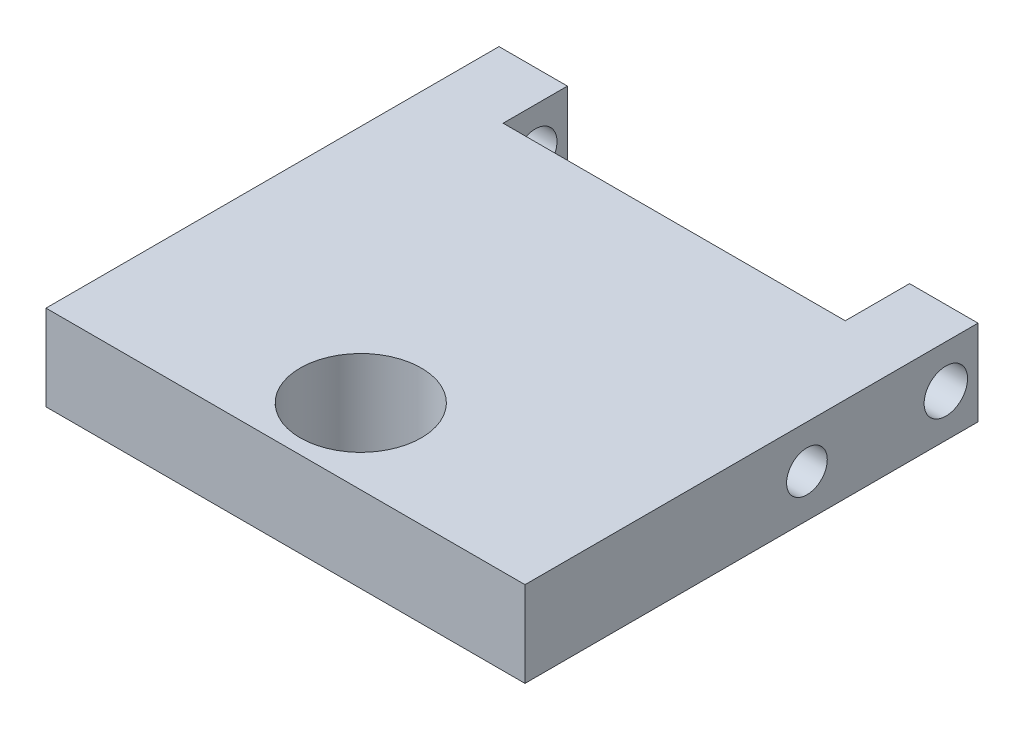
ISO-10303-21;
HEADER;
FILE_DESCRIPTION(('STEP AP214'),'2;1');
FILE_NAME('part.step','',(''),(''),'','','');
FILE_SCHEMA(('AUTOMOTIVE_DESIGN { 1 0 10303 214 1 1 1 1 }'));
ENDSEC;
DATA;
#1=APPLICATION_CONTEXT('core data for automotive mechanical design processes');
#2=APPLICATION_PROTOCOL_DEFINITION('international standard','automotive_design',2000,#1);
#3=PRODUCT_CONTEXT('',#1,'mechanical');
#4=PRODUCT('Part','Part','',(#3));
#5=PRODUCT_RELATED_PRODUCT_CATEGORY('part','',(#4));
#6=PRODUCT_DEFINITION_FORMATION('','',#4);
#7=PRODUCT_DEFINITION_CONTEXT('part definition',#1,'design');
#8=PRODUCT_DEFINITION('design','',#6,#7);
#9=PRODUCT_DEFINITION_SHAPE('','',#8);
#10=(LENGTH_UNIT() NAMED_UNIT(*) SI_UNIT(.MILLI.,.METRE.));
#11=(NAMED_UNIT(*) PLANE_ANGLE_UNIT() SI_UNIT($,.RADIAN.));
#12=(NAMED_UNIT(*) SI_UNIT($,.STERADIAN.) SOLID_ANGLE_UNIT());
#13=UNCERTAINTY_MEASURE_WITH_UNIT(LENGTH_MEASURE(1.E-05),#10,'distance_accuracy_value','');
#14=(GEOMETRIC_REPRESENTATION_CONTEXT(3) GLOBAL_UNCERTAINTY_ASSIGNED_CONTEXT((#13)) GLOBAL_UNIT_ASSIGNED_CONTEXT((#10,
#11,#12)) REPRESENTATION_CONTEXT('',''));
#15=CARTESIAN_POINT('',(0.,0.,0.));
#16=DIRECTION('',(0.,0.,1.));
#17=DIRECTION('',(1.,0.,0.));
#18=AXIS2_PLACEMENT_3D('',#15,#16,#17);
#19=CARTESIAN_POINT('',(-8.89,3.175,-8.4074));
#20=DIRECTION('',(0.,0.,1.));
#21=DIRECTION('',(1.,0.,0.));
#22=AXIS2_PLACEMENT_3D('',#19,#20,#21);
#23=PLANE('',#22);
#24=DIRECTION('',(0.,-1.,0.));
#25=VECTOR('',#24,1.);
#26=CARTESIAN_POINT('',(6.35,3.175,-8.4074));
#27=LINE('',#26,#25);
#28=CARTESIAN_POINT('',(6.35,3.175,-8.4074));
#29=VERTEX_POINT('',#28);
#30=CARTESIAN_POINT('',(6.35,0.,-8.4074));
#31=VERTEX_POINT('',#30);
#32=EDGE_CURVE('E156',#29,#31,#27,.T.);
#33=ORIENTED_EDGE('',*,*,#32,.F.);
#34=DIRECTION('',(-1.,0.,0.));
#35=VECTOR('',#34,1.);
#36=CARTESIAN_POINT('',(-8.89,3.175,-8.4074));
#37=LINE('',#36,#35);
#38=CARTESIAN_POINT('',(8.89,3.175,-8.4074));
#39=VERTEX_POINT('',#38);
#40=EDGE_CURVE('E89',#39,#29,#37,.T.);
#41=ORIENTED_EDGE('',*,*,#40,.F.);
#42=DIRECTION('',(0.,-1.,0.));
#43=VECTOR('',#42,1.);
#44=CARTESIAN_POINT('',(8.89,3.175,-8.4074));
#45=LINE('',#44,#43);
#46=CARTESIAN_POINT('',(8.89,0.,-8.4074));
#47=VERTEX_POINT('',#46);
#48=EDGE_CURVE('E152',#39,#47,#45,.T.);
#49=ORIENTED_EDGE('',*,*,#48,.T.);
#50=DIRECTION('',(-1.,0.,0.));
#51=VECTOR('',#50,1.);
#52=CARTESIAN_POINT('',(-8.89,0.,-8.4074));
#53=LINE('',#52,#51);
#54=EDGE_CURVE('E134',#47,#31,#53,.T.);
#55=ORIENTED_EDGE('',*,*,#54,.T.);
#56=EDGE_LOOP('',(#33,#41,#49,#55));
#57=FACE_BOUND('',#56,.T.);
#58=ADVANCED_FACE('F35',(#57),#23,.F.);
#59=CARTESIAN_POINT('',(8.89,3.175,8.4074));
#60=DIRECTION('',(-1.,0.,0.));
#61=DIRECTION('',(0.,0.,1.));
#62=AXIS2_PLACEMENT_3D('',#59,#60,#61);
#63=PLANE('',#62);
#64=CARTESIAN_POINT('',(8.89,1.5875,-2.0574));
#65=DIRECTION('',(1.,0.,0.));
#66=DIRECTION('',(0.,0.,-1.));
#67=AXIS2_PLACEMENT_3D('',#64,#65,#66);
#68=CIRCLE('',#67,0.755649999999988);
#69=CARTESIAN_POINT('',(8.89,1.5875,-2.81304999999999));
#70=VERTEX_POINT('',#69);
#71=EDGE_CURVE('E194',#70,#70,#68,.T.);
#72=ORIENTED_EDGE('',*,*,#71,.F.);
#73=EDGE_LOOP('',(#72));
#74=FACE_BOUND('',#73,.T.);
#75=CARTESIAN_POINT('',(8.89,1.5875,-7.2136));
#76=DIRECTION('',(1.,0.,0.));
#77=DIRECTION('',(0.,0.,-1.));
#78=AXIS2_PLACEMENT_3D('',#75,#76,#77);
#79=CIRCLE('',#78,0.806449999999998);
#80=CARTESIAN_POINT('',(8.89,1.5875,-8.02005));
#81=VERTEX_POINT('',#80);
#82=EDGE_CURVE('E188',#81,#81,#79,.T.);
#83=ORIENTED_EDGE('',*,*,#82,.F.);
#84=EDGE_LOOP('',(#83));
#85=FACE_BOUND('',#84,.T.);
#86=DIRECTION('',(0.,0.,-1.));
#87=VECTOR('',#86,1.);
#88=CARTESIAN_POINT('',(8.89,0.,8.4074));
#89=LINE('',#88,#87);
#90=CARTESIAN_POINT('',(8.89,0.,8.4074));
#91=VERTEX_POINT('',#90);
#92=EDGE_CURVE('E135',#91,#47,#89,.T.);
#93=ORIENTED_EDGE('',*,*,#92,.T.);
#94=ORIENTED_EDGE('',*,*,#48,.F.);
#95=DIRECTION('',(0.,0.,-1.));
#96=VECTOR('',#95,1.);
#97=CARTESIAN_POINT('',(8.89,3.175,8.4074));
#98=LINE('',#97,#96);
#99=CARTESIAN_POINT('',(8.89,3.175,8.4074));
#100=VERTEX_POINT('',#99);
#101=EDGE_CURVE('E145',#100,#39,#98,.T.);
#102=ORIENTED_EDGE('',*,*,#101,.F.);
#103=DIRECTION('',(0.,-1.,0.));
#104=VECTOR('',#103,1.);
#105=CARTESIAN_POINT('',(8.89,3.175,8.4074));
#106=LINE('',#105,#104);
#107=EDGE_CURVE('E146',#100,#91,#106,.T.);
#108=ORIENTED_EDGE('',*,*,#107,.T.);
#109=EDGE_LOOP('',(#93,#94,#102,#108));
#110=FACE_BOUND('',#109,.T.);
#111=ADVANCED_FACE('F37',(#74,#85,#110),#63,.F.);
#112=CARTESIAN_POINT('',(-6.35,3.175,-8.4074));
#113=VERTEX_POINT('',#112);
#114=CARTESIAN_POINT('',(-8.89,3.175,-8.4074));
#115=VERTEX_POINT('',#114);
#116=EDGE_CURVE('E166',#113,#115,#37,.T.);
#117=ORIENTED_EDGE('',*,*,#116,.F.);
#118=DIRECTION('',(0.,-1.,0.));
#119=VECTOR('',#118,1.);
#120=CARTESIAN_POINT('',(-6.35,3.175,-8.4074));
#121=LINE('',#120,#119);
#122=CARTESIAN_POINT('',(-6.35,0.,-8.4074));
#123=VERTEX_POINT('',#122);
#124=EDGE_CURVE('E139',#113,#123,#121,.T.);
#125=ORIENTED_EDGE('',*,*,#124,.T.);
#126=CARTESIAN_POINT('',(-8.89,0.,-8.4074));
#127=VERTEX_POINT('',#126);
#128=EDGE_CURVE('E129',#123,#127,#53,.T.);
#129=ORIENTED_EDGE('',*,*,#128,.T.);
#130=DIRECTION('',(0.,-1.,0.));
#131=VECTOR('',#130,1.);
#132=CARTESIAN_POINT('',(-8.89,3.175,-8.4074));
#133=LINE('',#132,#131);
#134=EDGE_CURVE('E150',#115,#127,#133,.T.);
#135=ORIENTED_EDGE('',*,*,#134,.F.);
#136=EDGE_LOOP('',(#117,#125,#129,#135));
#137=FACE_BOUND('',#136,.T.);
#138=ADVANCED_FACE('F202',(#137),#23,.F.);
#139=CARTESIAN_POINT('',(-8.89,3.175,8.4074));
#140=DIRECTION('',(1.,0.,0.));
#141=DIRECTION('',(0.,0.,-1.));
#142=AXIS2_PLACEMENT_3D('',#139,#140,#141);
#143=PLANE('',#142);
#144=CARTESIAN_POINT('',(-8.89,1.5875,-2.0574));
#145=DIRECTION('',(1.,0.,0.));
#146=DIRECTION('',(0.,0.,-1.));
#147=AXIS2_PLACEMENT_3D('',#144,#145,#146);
#148=CIRCLE('',#147,0.755649999999997);
#149=CARTESIAN_POINT('',(-8.89,1.5875,-2.81305));
#150=VERTEX_POINT('',#149);
#151=EDGE_CURVE('E191',#150,#150,#148,.T.);
#152=ORIENTED_EDGE('',*,*,#151,.T.);
#153=EDGE_LOOP('',(#152));
#154=FACE_BOUND('',#153,.T.);
#155=CARTESIAN_POINT('',(-8.89,1.5875,-7.2136));
#156=DIRECTION('',(1.,0.,0.));
#157=DIRECTION('',(0.,0.,-1.));
#158=AXIS2_PLACEMENT_3D('',#155,#156,#157);
#159=CIRCLE('',#158,0.806449999999995);
#160=CARTESIAN_POINT('',(-8.89,1.5875,-8.02005));
#161=VERTEX_POINT('',#160);
#162=EDGE_CURVE('E185',#161,#161,#159,.T.);
#163=ORIENTED_EDGE('',*,*,#162,.T.);
#164=EDGE_LOOP('',(#163));
#165=FACE_BOUND('',#164,.T.);
#166=DIRECTION('',(0.,0.,1.));
#167=VECTOR('',#166,1.);
#168=CARTESIAN_POINT('',(-8.89,0.,8.4074));
#169=LINE('',#168,#167);
#170=CARTESIAN_POINT('',(-8.89,0.,8.4074));
#171=VERTEX_POINT('',#170);
#172=EDGE_CURVE('E130',#127,#171,#169,.T.);
#173=ORIENTED_EDGE('',*,*,#172,.T.);
#174=DIRECTION('',(0.,-1.,0.));
#175=VECTOR('',#174,1.);
#176=CARTESIAN_POINT('',(-8.89,3.175,8.4074));
#177=LINE('',#176,#175);
#178=CARTESIAN_POINT('',(-8.89,3.175,8.4074));
#179=VERTEX_POINT('',#178);
#180=EDGE_CURVE('E148',#179,#171,#177,.T.);
#181=ORIENTED_EDGE('',*,*,#180,.F.);
#182=DIRECTION('',(0.,0.,1.));
#183=VECTOR('',#182,1.);
#184=CARTESIAN_POINT('',(-8.89,3.175,8.4074));
#185=LINE('',#184,#183);
#186=EDGE_CURVE('E162',#115,#179,#185,.T.);
#187=ORIENTED_EDGE('',*,*,#186,.F.);
#188=ORIENTED_EDGE('',*,*,#134,.T.);
#189=EDGE_LOOP('',(#173,#181,#187,#188));
#190=FACE_BOUND('',#189,.T.);
#191=ADVANCED_FACE('F225',(#154,#165,#190),#143,.F.);
#192=CARTESIAN_POINT('',(-8.89,3.175,8.4074));
#193=DIRECTION('',(0.,0.,-1.));
#194=DIRECTION('',(-1.,0.,0.));
#195=AXIS2_PLACEMENT_3D('',#192,#193,#194);
#196=PLANE('',#195);
#197=DIRECTION('',(1.,0.,0.));
#198=VECTOR('',#197,1.);
#199=CARTESIAN_POINT('',(-8.89,0.,8.4074));
#200=LINE('',#199,#198);
#201=EDGE_CURVE('E81',#171,#91,#200,.T.);
#202=ORIENTED_EDGE('',*,*,#201,.T.);
#203=ORIENTED_EDGE('',*,*,#107,.F.);
#204=DIRECTION('',(1.,0.,0.));
#205=VECTOR('',#204,1.);
#206=CARTESIAN_POINT('',(-8.89,3.175,8.4074));
#207=LINE('',#206,#205);
#208=EDGE_CURVE('E60',#179,#100,#207,.T.);
#209=ORIENTED_EDGE('',*,*,#208,.F.);
#210=ORIENTED_EDGE('',*,*,#180,.T.);
#211=EDGE_LOOP('',(#202,#203,#209,#210));
#212=FACE_BOUND('',#211,.T.);
#213=ADVANCED_FACE('F160',(#212),#196,.F.);
#214=CARTESIAN_POINT('',(0.,3.175,0.));
#215=DIRECTION('',(0.,-1.,0.));
#216=DIRECTION('',(0.,0.,-1.));
#217=AXIS2_PLACEMENT_3D('',#214,#215,#216);
#218=PLANE('',#217);
#219=CARTESIAN_POINT('',(0.,3.175,5.6134));
#220=DIRECTION('',(0.,1.,0.));
#221=DIRECTION('',(0.,0.,1.));
#222=AXIS2_PLACEMENT_3D('',#219,#220,#221);
#223=CIRCLE('',#222,2.2479);
#224=CARTESIAN_POINT('',(0.,3.175,7.8613));
#225=VERTEX_POINT('',#224);
#226=EDGE_CURVE('E179',#225,#225,#223,.T.);
#227=ORIENTED_EDGE('',*,*,#226,.F.);
#228=EDGE_LOOP('',(#227));
#229=FACE_BOUND('',#228,.T.);
#230=DIRECTION('',(1.,0.,0.));
#231=VECTOR('',#230,1.);
#232=CARTESIAN_POINT('',(-6.35,3.175,-6.0198));
#233=LINE('',#232,#231);
#234=CARTESIAN_POINT('',(-6.35,3.175,-6.0198));
#235=VERTEX_POINT('',#234);
#236=CARTESIAN_POINT('',(6.35,3.175,-6.0198));
#237=VERTEX_POINT('',#236);
#238=EDGE_CURVE('E173',#235,#237,#233,.T.);
#239=ORIENTED_EDGE('',*,*,#238,.F.);
#240=DIRECTION('',(0.,0.,1.));
#241=VECTOR('',#240,1.);
#242=CARTESIAN_POINT('',(-6.35,3.175,-10.795));
#243=LINE('',#242,#241);
#244=EDGE_CURVE('E116',#113,#235,#243,.T.);
#245=ORIENTED_EDGE('',*,*,#244,.F.);
#246=ORIENTED_EDGE('',*,*,#116,.T.);
#247=ORIENTED_EDGE('',*,*,#186,.T.);
#248=ORIENTED_EDGE('',*,*,#208,.T.);
#249=ORIENTED_EDGE('',*,*,#101,.T.);
#250=ORIENTED_EDGE('',*,*,#40,.T.);
#251=DIRECTION('',(0.,0.,1.));
#252=VECTOR('',#251,1.);
#253=CARTESIAN_POINT('',(6.35,3.175,-10.795));
#254=LINE('',#253,#252);
#255=EDGE_CURVE('E124',#29,#237,#254,.T.);
#256=ORIENTED_EDGE('',*,*,#255,.T.);
#257=EDGE_LOOP('',(#239,#245,#246,#247,#248,#249,#250,#256));
#258=FACE_BOUND('',#257,.T.);
#259=ADVANCED_FACE('F232',(#229,#258),#218,.F.);
#260=CARTESIAN_POINT('',(0.,0.,0.));
#261=DIRECTION('',(0.,-1.,0.));
#262=DIRECTION('',(0.,0.,-1.));
#263=AXIS2_PLACEMENT_3D('',#260,#261,#262);
#264=PLANE('',#263);
#265=CARTESIAN_POINT('',(0.,0.,5.6134));
#266=DIRECTION('',(0.,1.,0.));
#267=DIRECTION('',(0.,0.,1.));
#268=AXIS2_PLACEMENT_3D('',#265,#266,#267);
#269=CIRCLE('',#268,2.2479);
#270=CARTESIAN_POINT('',(0.,0.,7.8613));
#271=VERTEX_POINT('',#270);
#272=EDGE_CURVE('E175',#271,#271,#269,.T.);
#273=ORIENTED_EDGE('',*,*,#272,.T.);
#274=EDGE_LOOP('',(#273));
#275=FACE_BOUND('',#274,.T.);
#276=DIRECTION('',(0.,0.,-1.));
#277=VECTOR('',#276,1.);
#278=CARTESIAN_POINT('',(-6.35,0.,0.));
#279=LINE('',#278,#277);
#280=CARTESIAN_POINT('',(-6.35,0.,-6.0198));
#281=VERTEX_POINT('',#280);
#282=EDGE_CURVE('E11',#281,#123,#279,.T.);
#283=ORIENTED_EDGE('',*,*,#282,.F.);
#284=DIRECTION('',(1.,0.,0.));
#285=VECTOR('',#284,1.);
#286=CARTESIAN_POINT('',(-6.35,0.,-6.0198));
#287=LINE('',#286,#285);
#288=CARTESIAN_POINT('',(6.35,0.,-6.0198));
#289=VERTEX_POINT('',#288);
#290=EDGE_CURVE('E118',#281,#289,#287,.T.);
#291=ORIENTED_EDGE('',*,*,#290,.T.);
#292=DIRECTION('',(0.,0.,-1.));
#293=VECTOR('',#292,1.);
#294=CARTESIAN_POINT('',(6.35,0.,0.));
#295=LINE('',#294,#293);
#296=EDGE_CURVE('E44',#289,#31,#295,.T.);
#297=ORIENTED_EDGE('',*,*,#296,.T.);
#298=ORIENTED_EDGE('',*,*,#54,.F.);
#299=ORIENTED_EDGE('',*,*,#92,.F.);
#300=ORIENTED_EDGE('',*,*,#201,.F.);
#301=ORIENTED_EDGE('',*,*,#172,.F.);
#302=ORIENTED_EDGE('',*,*,#128,.F.);
#303=EDGE_LOOP('',(#283,#291,#297,#298,#299,#300,#301,#302));
#304=FACE_BOUND('',#303,.T.);
#305=ADVANCED_FACE('F127',(#275,#304),#264,.T.);
#306=CARTESIAN_POINT('',(-6.35,0.,-10.795));
#307=DIRECTION('',(-1.,0.,0.));
#308=DIRECTION('',(0.,0.,1.));
#309=AXIS2_PLACEMENT_3D('',#306,#307,#308);
#310=PLANE('',#309);
#311=CARTESIAN_POINT('',(-6.35,1.5875,-7.2136));
#312=DIRECTION('',(-1.,0.,0.));
#313=DIRECTION('',(0.,0.,1.));
#314=AXIS2_PLACEMENT_3D('',#311,#312,#313);
#315=CIRCLE('',#314,0.806449999999997);
#316=CARTESIAN_POINT('',(-6.35,1.5875,-6.40715));
#317=VERTEX_POINT('',#316);
#318=EDGE_CURVE('E182',#317,#317,#315,.T.);
#319=ORIENTED_EDGE('',*,*,#318,.T.);
#320=EDGE_LOOP('',(#319));
#321=FACE_BOUND('',#320,.T.);
#322=ORIENTED_EDGE('',*,*,#244,.T.);
#323=DIRECTION('',(0.,1.,0.));
#324=VECTOR('',#323,1.);
#325=CARTESIAN_POINT('',(-6.35,0.,-6.0198));
#326=LINE('',#325,#324);
#327=EDGE_CURVE('E111',#281,#235,#326,.T.);
#328=ORIENTED_EDGE('',*,*,#327,.F.);
#329=ORIENTED_EDGE('',*,*,#282,.T.);
#330=ORIENTED_EDGE('',*,*,#124,.F.);
#331=EDGE_LOOP('',(#322,#328,#329,#330));
#332=FACE_BOUND('',#331,.T.);
#333=ADVANCED_FACE('F112',(#321,#332),#310,.F.);
#334=CARTESIAN_POINT('',(6.35,0.,-10.795));
#335=DIRECTION('',(-1.,0.,0.));
#336=DIRECTION('',(0.,0.,1.));
#337=AXIS2_PLACEMENT_3D('',#334,#335,#336);
#338=PLANE('',#337);
#339=CARTESIAN_POINT('',(6.35,1.5875,-7.2136));
#340=DIRECTION('',(-1.,0.,0.));
#341=DIRECTION('',(0.,0.,1.));
#342=AXIS2_PLACEMENT_3D('',#339,#340,#341);
#343=CIRCLE('',#342,0.806449999999997);
#344=CARTESIAN_POINT('',(6.35,1.5875,-6.40715));
#345=VERTEX_POINT('',#344);
#346=EDGE_CURVE('E39',#345,#345,#343,.T.);
#347=ORIENTED_EDGE('',*,*,#346,.F.);
#348=EDGE_LOOP('',(#347));
#349=FACE_BOUND('',#348,.T.);
#350=ORIENTED_EDGE('',*,*,#32,.T.);
#351=ORIENTED_EDGE('',*,*,#296,.F.);
#352=DIRECTION('',(0.,1.,0.));
#353=VECTOR('',#352,1.);
#354=CARTESIAN_POINT('',(6.35,0.,-6.0198));
#355=LINE('',#354,#353);
#356=EDGE_CURVE('E51',#289,#237,#355,.T.);
#357=ORIENTED_EDGE('',*,*,#356,.T.);
#358=ORIENTED_EDGE('',*,*,#255,.F.);
#359=EDGE_LOOP('',(#350,#351,#357,#358));
#360=FACE_BOUND('',#359,.T.);
#361=ADVANCED_FACE('F233',(#349,#360),#338,.T.);
#362=CARTESIAN_POINT('',(-6.35,0.,-6.0198));
#363=DIRECTION('',(0.,0.,1.));
#364=DIRECTION('',(1.,0.,0.));
#365=AXIS2_PLACEMENT_3D('',#362,#363,#364);
#366=PLANE('',#365);
#367=ORIENTED_EDGE('',*,*,#238,.T.);
#368=ORIENTED_EDGE('',*,*,#356,.F.);
#369=ORIENTED_EDGE('',*,*,#290,.F.);
#370=ORIENTED_EDGE('',*,*,#327,.T.);
#371=EDGE_LOOP('',(#367,#368,#369,#370));
#372=FACE_BOUND('',#371,.T.);
#373=ADVANCED_FACE('F121',(#372),#366,.F.);
#374=CARTESIAN_POINT('',(0.,3.175,5.6134));
#375=DIRECTION('',(0.,1.,0.));
#376=DIRECTION('',(0.,0.,1.));
#377=AXIS2_PLACEMENT_3D('',#374,#375,#376);
#378=CYLINDRICAL_SURFACE('',#377,2.2479);
#379=ORIENTED_EDGE('',*,*,#272,.F.);
#380=EDGE_LOOP('',(#379));
#381=FACE_BOUND('',#380,.T.);
#382=ORIENTED_EDGE('',*,*,#226,.T.);
#383=EDGE_LOOP('',(#382));
#384=FACE_BOUND('',#383,.T.);
#385=ADVANCED_FACE('F208',(#381,#384),#378,.F.);
#386=CARTESIAN_POINT('',(8.89,1.5875,-7.2136));
#387=DIRECTION('',(1.,0.,0.));
#388=DIRECTION('',(0.,0.,-1.));
#389=AXIS2_PLACEMENT_3D('',#386,#387,#388);
#390=CYLINDRICAL_SURFACE('',#389,0.806449999999997);
#391=ORIENTED_EDGE('',*,*,#346,.T.);
#392=EDGE_LOOP('',(#391));
#393=FACE_BOUND('',#392,.T.);
#394=ORIENTED_EDGE('',*,*,#82,.T.);
#395=EDGE_LOOP('',(#394));
#396=FACE_BOUND('',#395,.T.);
#397=ADVANCED_FACE('F205',(#393,#396),#390,.F.);
#398=ORIENTED_EDGE('',*,*,#162,.F.);
#399=EDGE_LOOP('',(#398));
#400=FACE_BOUND('',#399,.T.);
#401=ORIENTED_EDGE('',*,*,#318,.F.);
#402=EDGE_LOOP('',(#401));
#403=FACE_BOUND('',#402,.T.);
#404=ADVANCED_FACE('F207',(#400,#403),#390,.F.);
#405=CARTESIAN_POINT('',(8.89,1.5875,-2.0574));
#406=DIRECTION('',(1.,0.,0.));
#407=DIRECTION('',(0.,0.,-1.));
#408=AXIS2_PLACEMENT_3D('',#405,#406,#407);
#409=CYLINDRICAL_SURFACE('',#408,0.755649999999992);
#410=ORIENTED_EDGE('',*,*,#151,.F.);
#411=EDGE_LOOP('',(#410));
#412=FACE_BOUND('',#411,.T.);
#413=ORIENTED_EDGE('',*,*,#71,.T.);
#414=EDGE_LOOP('',(#413));
#415=FACE_BOUND('',#414,.T.);
#416=ADVANCED_FACE('F198',(#412,#415),#409,.F.);
#417=CLOSED_SHELL('',(#58,#111,#138,#191,#213,#259,#305,#333,#361,#373,#385,#397,#404,#416));
#418=MANIFOLD_SOLID_BREP('B2',#417);
#419=ADVANCED_BREP_SHAPE_REPRESENTATION('',(#18,#418),#14);
#420=SHAPE_DEFINITION_REPRESENTATION(#9,#419);
ENDSEC;
END-ISO-10303-21;
